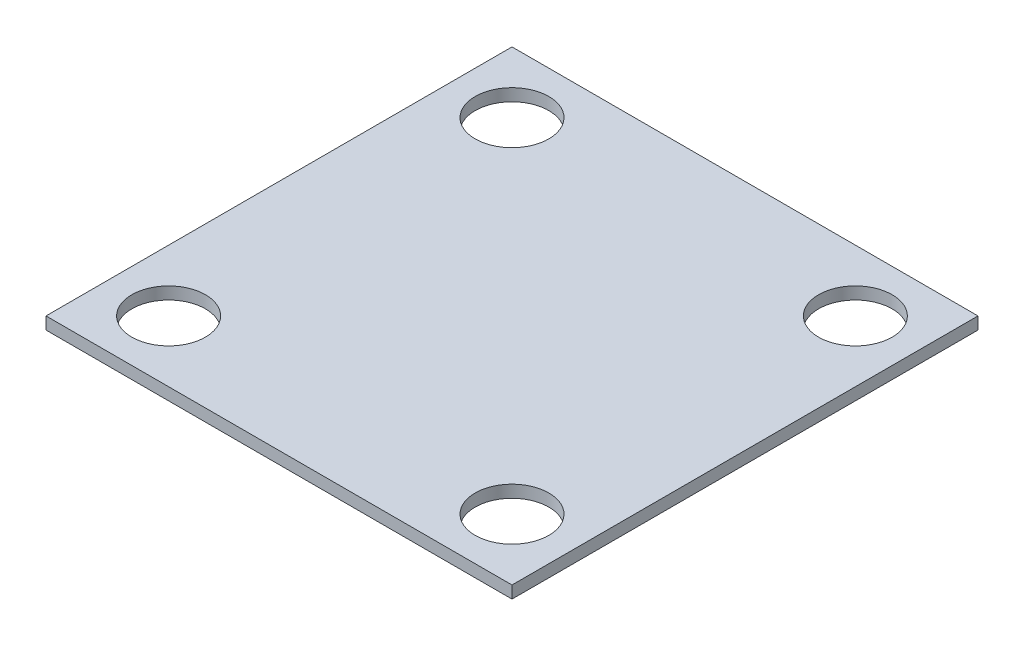
ISO-10303-21;
HEADER;
FILE_DESCRIPTION(('STEP AP214'),'2;1');
FILE_NAME('part.step','',(''),(''),'','','');
FILE_SCHEMA(('AUTOMOTIVE_DESIGN { 1 0 10303 214 1 1 1 1 }'));
ENDSEC;
DATA;
#1=APPLICATION_CONTEXT('core data for automotive mechanical design processes');
#2=APPLICATION_PROTOCOL_DEFINITION('international standard','automotive_design',2000,#1);
#3=PRODUCT_CONTEXT('',#1,'mechanical');
#4=PRODUCT('Part','Part','',(#3));
#5=PRODUCT_RELATED_PRODUCT_CATEGORY('part','',(#4));
#6=PRODUCT_DEFINITION_FORMATION('','',#4);
#7=PRODUCT_DEFINITION_CONTEXT('part definition',#1,'design');
#8=PRODUCT_DEFINITION('design','',#6,#7);
#9=PRODUCT_DEFINITION_SHAPE('','',#8);
#10=(LENGTH_UNIT() NAMED_UNIT(*) SI_UNIT(.MILLI.,.METRE.));
#11=(NAMED_UNIT(*) PLANE_ANGLE_UNIT() SI_UNIT($,.RADIAN.));
#12=(NAMED_UNIT(*) SI_UNIT($,.STERADIAN.) SOLID_ANGLE_UNIT());
#13=UNCERTAINTY_MEASURE_WITH_UNIT(LENGTH_MEASURE(1.E-05),#10,'distance_accuracy_value','');
#14=(GEOMETRIC_REPRESENTATION_CONTEXT(3) GLOBAL_UNCERTAINTY_ASSIGNED_CONTEXT((#13)) GLOBAL_UNIT_ASSIGNED_CONTEXT((#10,
#11,#12)) REPRESENTATION_CONTEXT('',''));
#15=CARTESIAN_POINT('',(0.,0.,0.));
#16=DIRECTION('',(0.,0.,1.));
#17=DIRECTION('',(1.,0.,0.));
#18=AXIS2_PLACEMENT_3D('',#15,#16,#17);
#19=CARTESIAN_POINT('',(0.,1.,0.));
#20=DIRECTION('',(0.,1.,0.));
#21=DIRECTION('',(0.,0.,1.));
#22=AXIS2_PLACEMENT_3D('',#19,#20,#21);
#23=PLANE('',#22);
#24=CARTESIAN_POINT('',(14.,1.,14.));
#25=DIRECTION('',(0.,1.,0.));
#26=DIRECTION('',(0.,0.,1.));
#27=AXIS2_PLACEMENT_3D('',#24,#25,#26);
#28=CIRCLE('',#27,3.);
#29=CARTESIAN_POINT('',(14.,1.,17.));
#30=VERTEX_POINT('',#29);
#31=EDGE_CURVE('E123',#30,#30,#28,.T.);
#32=ORIENTED_EDGE('',*,*,#31,.F.);
#33=EDGE_LOOP('',(#32));
#34=FACE_BOUND('',#33,.T.);
#35=CARTESIAN_POINT('',(-14.,1.,-14.));
#36=DIRECTION('',(0.,1.,0.));
#37=DIRECTION('',(0.,0.,1.));
#38=AXIS2_PLACEMENT_3D('',#35,#36,#37);
#39=CIRCLE('',#38,3.);
#40=CARTESIAN_POINT('',(-14.,1.,-11.));
#41=VERTEX_POINT('',#40);
#42=EDGE_CURVE('E102',#41,#41,#39,.T.);
#43=ORIENTED_EDGE('',*,*,#42,.F.);
#44=EDGE_LOOP('',(#43));
#45=FACE_BOUND('',#44,.T.);
#46=DIRECTION('',(0.,0.,1.));
#47=VECTOR('',#46,1.);
#48=CARTESIAN_POINT('',(-19.,1.,19.));
#49=LINE('',#48,#47);
#50=CARTESIAN_POINT('',(-19.,1.,-19.));
#51=VERTEX_POINT('',#50);
#52=CARTESIAN_POINT('',(-19.,1.,19.));
#53=VERTEX_POINT('',#52);
#54=EDGE_CURVE('E87',#51,#53,#49,.T.);
#55=ORIENTED_EDGE('',*,*,#54,.T.);
#56=DIRECTION('',(1.,0.,0.));
#57=VECTOR('',#56,1.);
#58=CARTESIAN_POINT('',(19.,1.,19.));
#59=LINE('',#58,#57);
#60=CARTESIAN_POINT('',(19.,1.,19.));
#61=VERTEX_POINT('',#60);
#62=EDGE_CURVE('E82',#53,#61,#59,.T.);
#63=ORIENTED_EDGE('',*,*,#62,.T.);
#64=DIRECTION('',(0.,0.,-1.));
#65=VECTOR('',#64,1.);
#66=CARTESIAN_POINT('',(19.,1.,19.));
#67=LINE('',#66,#65);
#68=CARTESIAN_POINT('',(19.,1.,-19.));
#69=VERTEX_POINT('',#68);
#70=EDGE_CURVE('E85',#61,#69,#67,.T.);
#71=ORIENTED_EDGE('',*,*,#70,.T.);
#72=DIRECTION('',(-1.,0.,0.));
#73=VECTOR('',#72,1.);
#74=CARTESIAN_POINT('',(19.,1.,-19.));
#75=LINE('',#74,#73);
#76=EDGE_CURVE('E52',#69,#51,#75,.T.);
#77=ORIENTED_EDGE('',*,*,#76,.T.);
#78=EDGE_LOOP('',(#55,#63,#71,#77));
#79=FACE_BOUND('',#78,.T.);
#80=CARTESIAN_POINT('',(14.,1.,-14.));
#81=DIRECTION('',(0.,1.,0.));
#82=DIRECTION('',(0.,0.,1.));
#83=AXIS2_PLACEMENT_3D('',#80,#81,#82);
#84=CIRCLE('',#83,3.);
#85=CARTESIAN_POINT('',(14.,1.,-11.));
#86=VERTEX_POINT('',#85);
#87=EDGE_CURVE('E117',#86,#86,#84,.T.);
#88=ORIENTED_EDGE('',*,*,#87,.F.);
#89=EDGE_LOOP('',(#88));
#90=FACE_BOUND('',#89,.T.);
#91=CARTESIAN_POINT('',(-14.,1.,14.));
#92=DIRECTION('',(0.,1.,0.));
#93=DIRECTION('',(0.,0.,1.));
#94=AXIS2_PLACEMENT_3D('',#91,#92,#93);
#95=CIRCLE('',#94,3.);
#96=CARTESIAN_POINT('',(-14.,1.,17.));
#97=VERTEX_POINT('',#96);
#98=EDGE_CURVE('E129',#97,#97,#95,.T.);
#99=ORIENTED_EDGE('',*,*,#98,.F.);
#100=EDGE_LOOP('',(#99));
#101=FACE_BOUND('',#100,.T.);
#102=ADVANCED_FACE('F35',(#34,#45,#79,#90,#101),#23,.T.);
#103=CARTESIAN_POINT('',(0.,0.,0.));
#104=DIRECTION('',(0.,1.,0.));
#105=DIRECTION('',(0.,0.,1.));
#106=AXIS2_PLACEMENT_3D('',#103,#104,#105);
#107=PLANE('',#106);
#108=DIRECTION('',(0.,0.,1.));
#109=VECTOR('',#108,1.);
#110=CARTESIAN_POINT('',(-19.,0.,19.));
#111=LINE('',#110,#109);
#112=CARTESIAN_POINT('',(-19.,0.,-19.));
#113=VERTEX_POINT('',#112);
#114=CARTESIAN_POINT('',(-19.,0.,19.));
#115=VERTEX_POINT('',#114);
#116=EDGE_CURVE('E99',#113,#115,#111,.T.);
#117=ORIENTED_EDGE('',*,*,#116,.F.);
#118=DIRECTION('',(-1.,0.,0.));
#119=VECTOR('',#118,1.);
#120=CARTESIAN_POINT('',(19.,0.,-19.));
#121=LINE('',#120,#119);
#122=CARTESIAN_POINT('',(19.,0.,-19.));
#123=VERTEX_POINT('',#122);
#124=EDGE_CURVE('E75',#123,#113,#121,.T.);
#125=ORIENTED_EDGE('',*,*,#124,.F.);
#126=DIRECTION('',(0.,0.,-1.));
#127=VECTOR('',#126,1.);
#128=CARTESIAN_POINT('',(19.,0.,19.));
#129=LINE('',#128,#127);
#130=CARTESIAN_POINT('',(19.,0.,19.));
#131=VERTEX_POINT('',#130);
#132=EDGE_CURVE('E69',#131,#123,#129,.T.);
#133=ORIENTED_EDGE('',*,*,#132,.F.);
#134=DIRECTION('',(1.,0.,0.));
#135=VECTOR('',#134,1.);
#136=CARTESIAN_POINT('',(19.,0.,19.));
#137=LINE('',#136,#135);
#138=EDGE_CURVE('E91',#115,#131,#137,.T.);
#139=ORIENTED_EDGE('',*,*,#138,.F.);
#140=EDGE_LOOP('',(#117,#125,#133,#139));
#141=FACE_BOUND('',#140,.T.);
#142=CARTESIAN_POINT('',(-14.,0.,-14.));
#143=DIRECTION('',(0.,1.,0.));
#144=DIRECTION('',(0.,0.,1.));
#145=AXIS2_PLACEMENT_3D('',#142,#143,#144);
#146=CIRCLE('',#145,3.);
#147=CARTESIAN_POINT('',(-14.,0.,-11.));
#148=VERTEX_POINT('',#147);
#149=EDGE_CURVE('E114',#148,#148,#146,.T.);
#150=ORIENTED_EDGE('',*,*,#149,.T.);
#151=EDGE_LOOP('',(#150));
#152=FACE_BOUND('',#151,.T.);
#153=CARTESIAN_POINT('',(14.,0.,-14.));
#154=DIRECTION('',(0.,1.,0.));
#155=DIRECTION('',(0.,0.,1.));
#156=AXIS2_PLACEMENT_3D('',#153,#154,#155);
#157=CIRCLE('',#156,3.);
#158=CARTESIAN_POINT('',(14.,0.,-11.));
#159=VERTEX_POINT('',#158);
#160=EDGE_CURVE('E120',#159,#159,#157,.T.);
#161=ORIENTED_EDGE('',*,*,#160,.T.);
#162=EDGE_LOOP('',(#161));
#163=FACE_BOUND('',#162,.T.);
#164=CARTESIAN_POINT('',(14.,0.,14.));
#165=DIRECTION('',(0.,1.,0.));
#166=DIRECTION('',(0.,0.,1.));
#167=AXIS2_PLACEMENT_3D('',#164,#165,#166);
#168=CIRCLE('',#167,3.);
#169=CARTESIAN_POINT('',(14.,0.,17.));
#170=VERTEX_POINT('',#169);
#171=EDGE_CURVE('E126',#170,#170,#168,.T.);
#172=ORIENTED_EDGE('',*,*,#171,.T.);
#173=EDGE_LOOP('',(#172));
#174=FACE_BOUND('',#173,.T.);
#175=CARTESIAN_POINT('',(-14.,0.,14.));
#176=DIRECTION('',(0.,1.,0.));
#177=DIRECTION('',(0.,0.,1.));
#178=AXIS2_PLACEMENT_3D('',#175,#176,#177);
#179=CIRCLE('',#178,3.);
#180=CARTESIAN_POINT('',(-14.,0.,17.));
#181=VERTEX_POINT('',#180);
#182=EDGE_CURVE('E132',#181,#181,#179,.T.);
#183=ORIENTED_EDGE('',*,*,#182,.T.);
#184=EDGE_LOOP('',(#183));
#185=FACE_BOUND('',#184,.T.);
#186=ADVANCED_FACE('F110',(#141,#152,#163,#174,#185),#107,.F.);
#187=CARTESIAN_POINT('',(-19.,1.,19.));
#188=DIRECTION('',(1.,0.,0.));
#189=DIRECTION('',(0.,0.,-1.));
#190=AXIS2_PLACEMENT_3D('',#187,#188,#189);
#191=PLANE('',#190);
#192=ORIENTED_EDGE('',*,*,#116,.T.);
#193=DIRECTION('',(0.,-1.,0.));
#194=VECTOR('',#193,1.);
#195=CARTESIAN_POINT('',(-19.,1.,19.));
#196=LINE('',#195,#194);
#197=EDGE_CURVE('E11',#53,#115,#196,.T.);
#198=ORIENTED_EDGE('',*,*,#197,.F.);
#199=ORIENTED_EDGE('',*,*,#54,.F.);
#200=DIRECTION('',(0.,-1.,0.));
#201=VECTOR('',#200,1.);
#202=CARTESIAN_POINT('',(-19.,1.,-19.));
#203=LINE('',#202,#201);
#204=EDGE_CURVE('E95',#51,#113,#203,.T.);
#205=ORIENTED_EDGE('',*,*,#204,.T.);
#206=EDGE_LOOP('',(#192,#198,#199,#205));
#207=FACE_BOUND('',#206,.T.);
#208=ADVANCED_FACE('F37',(#207),#191,.F.);
#209=CARTESIAN_POINT('',(19.,1.,19.));
#210=DIRECTION('',(0.,0.,-1.));
#211=DIRECTION('',(-1.,0.,0.));
#212=AXIS2_PLACEMENT_3D('',#209,#210,#211);
#213=PLANE('',#212);
#214=ORIENTED_EDGE('',*,*,#138,.T.);
#215=DIRECTION('',(0.,-1.,0.));
#216=VECTOR('',#215,1.);
#217=CARTESIAN_POINT('',(19.,1.,19.));
#218=LINE('',#217,#216);
#219=EDGE_CURVE('E44',#61,#131,#218,.T.);
#220=ORIENTED_EDGE('',*,*,#219,.F.);
#221=ORIENTED_EDGE('',*,*,#62,.F.);
#222=ORIENTED_EDGE('',*,*,#197,.T.);
#223=EDGE_LOOP('',(#214,#220,#221,#222));
#224=FACE_BOUND('',#223,.T.);
#225=ADVANCED_FACE('F90',(#224),#213,.F.);
#226=CARTESIAN_POINT('',(19.,1.,19.));
#227=DIRECTION('',(-1.,0.,0.));
#228=DIRECTION('',(0.,0.,1.));
#229=AXIS2_PLACEMENT_3D('',#226,#227,#228);
#230=PLANE('',#229);
#231=ORIENTED_EDGE('',*,*,#132,.T.);
#232=DIRECTION('',(0.,-1.,0.));
#233=VECTOR('',#232,1.);
#234=CARTESIAN_POINT('',(19.,1.,-19.));
#235=LINE('',#234,#233);
#236=EDGE_CURVE('E92',#69,#123,#235,.T.);
#237=ORIENTED_EDGE('',*,*,#236,.F.);
#238=ORIENTED_EDGE('',*,*,#70,.F.);
#239=ORIENTED_EDGE('',*,*,#219,.T.);
#240=EDGE_LOOP('',(#231,#237,#238,#239));
#241=FACE_BOUND('',#240,.T.);
#242=ADVANCED_FACE('F93',(#241),#230,.F.);
#243=CARTESIAN_POINT('',(19.,1.,-19.));
#244=DIRECTION('',(0.,0.,1.));
#245=DIRECTION('',(1.,0.,0.));
#246=AXIS2_PLACEMENT_3D('',#243,#244,#245);
#247=PLANE('',#246);
#248=ORIENTED_EDGE('',*,*,#124,.T.);
#249=ORIENTED_EDGE('',*,*,#204,.F.);
#250=ORIENTED_EDGE('',*,*,#76,.F.);
#251=ORIENTED_EDGE('',*,*,#236,.T.);
#252=EDGE_LOOP('',(#248,#249,#250,#251));
#253=FACE_BOUND('',#252,.T.);
#254=ADVANCED_FACE('F107',(#253),#247,.F.);
#255=CARTESIAN_POINT('',(-14.,1.,-14.));
#256=DIRECTION('',(0.,-1.,0.));
#257=DIRECTION('',(0.,0.,-1.));
#258=AXIS2_PLACEMENT_3D('',#255,#256,#257);
#259=CYLINDRICAL_SURFACE('',#258,3.);
#260=ORIENTED_EDGE('',*,*,#42,.T.);
#261=EDGE_LOOP('',(#260));
#262=FACE_BOUND('',#261,.T.);
#263=ORIENTED_EDGE('',*,*,#149,.F.);
#264=EDGE_LOOP('',(#263));
#265=FACE_BOUND('',#264,.T.);
#266=ADVANCED_FACE('F151',(#262,#265),#259,.F.);
#267=CARTESIAN_POINT('',(14.,1.,-14.));
#268=DIRECTION('',(0.,-1.,0.));
#269=DIRECTION('',(0.,0.,-1.));
#270=AXIS2_PLACEMENT_3D('',#267,#268,#269);
#271=CYLINDRICAL_SURFACE('',#270,3.);
#272=ORIENTED_EDGE('',*,*,#87,.T.);
#273=EDGE_LOOP('',(#272));
#274=FACE_BOUND('',#273,.T.);
#275=ORIENTED_EDGE('',*,*,#160,.F.);
#276=EDGE_LOOP('',(#275));
#277=FACE_BOUND('',#276,.T.);
#278=ADVANCED_FACE('F197',(#274,#277),#271,.F.);
#279=CARTESIAN_POINT('',(14.,1.,14.));
#280=DIRECTION('',(0.,-1.,0.));
#281=DIRECTION('',(0.,0.,-1.));
#282=AXIS2_PLACEMENT_3D('',#279,#280,#281);
#283=CYLINDRICAL_SURFACE('',#282,3.);
#284=ORIENTED_EDGE('',*,*,#31,.T.);
#285=EDGE_LOOP('',(#284));
#286=FACE_BOUND('',#285,.T.);
#287=ORIENTED_EDGE('',*,*,#171,.F.);
#288=EDGE_LOOP('',(#287));
#289=FACE_BOUND('',#288,.T.);
#290=ADVANCED_FACE('F205',(#286,#289),#283,.F.);
#291=CARTESIAN_POINT('',(-14.,1.,14.));
#292=DIRECTION('',(0.,-1.,0.));
#293=DIRECTION('',(0.,0.,-1.));
#294=AXIS2_PLACEMENT_3D('',#291,#292,#293);
#295=CYLINDRICAL_SURFACE('',#294,3.);
#296=ORIENTED_EDGE('',*,*,#98,.T.);
#297=EDGE_LOOP('',(#296));
#298=FACE_BOUND('',#297,.T.);
#299=ORIENTED_EDGE('',*,*,#182,.F.);
#300=EDGE_LOOP('',(#299));
#301=FACE_BOUND('',#300,.T.);
#302=ADVANCED_FACE('F138',(#298,#301),#295,.F.);
#303=CLOSED_SHELL('',(#102,#186,#208,#225,#242,#254,#266,#278,#290,#302));
#304=MANIFOLD_SOLID_BREP('B2',#303);
#305=ADVANCED_BREP_SHAPE_REPRESENTATION('',(#18,#304),#14);
#306=SHAPE_DEFINITION_REPRESENTATION(#9,#305);
ENDSEC;
END-ISO-10303-21;
